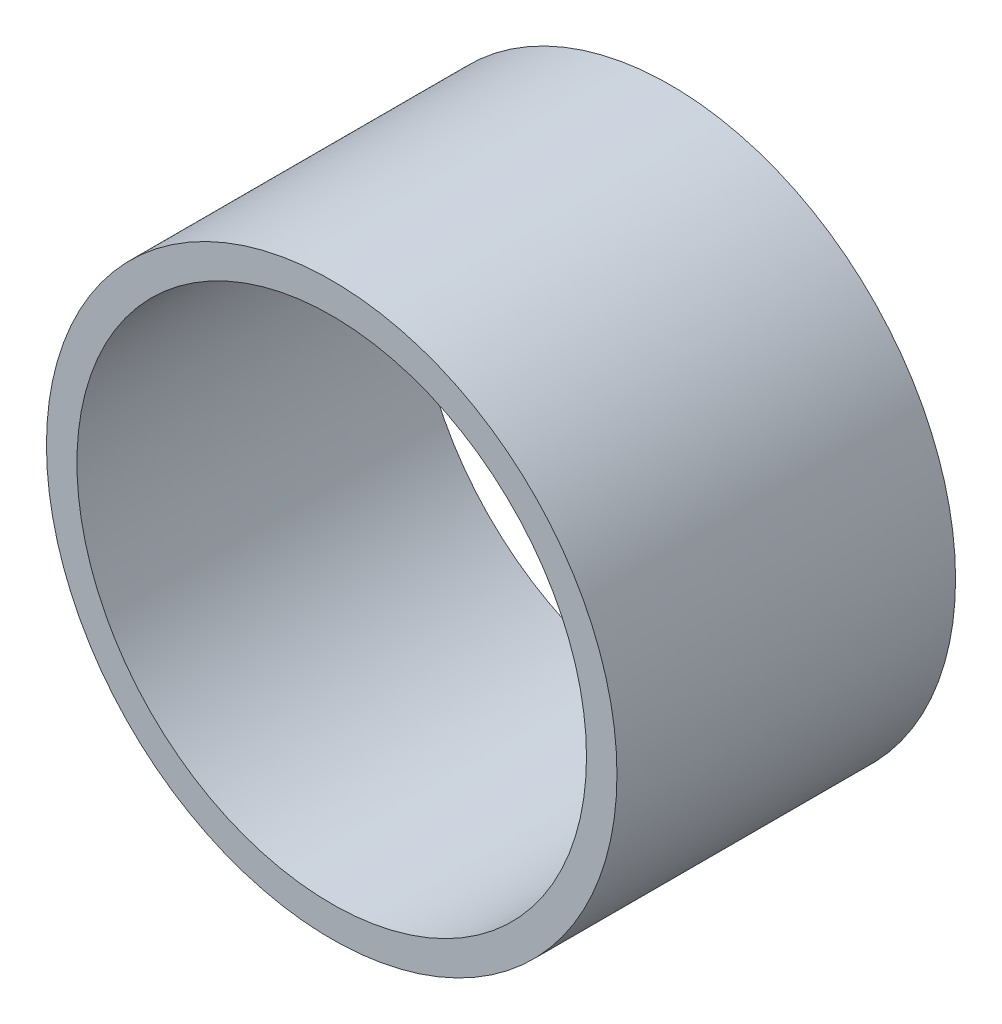
ISO-10303-21;
HEADER;
FILE_DESCRIPTION(('STEP AP214'),'2;1');
FILE_NAME('part.step','',(''),(''),'','','');
FILE_SCHEMA(('AUTOMOTIVE_DESIGN { 1 0 10303 214 1 1 1 1 }'));
ENDSEC;
DATA;
#1=APPLICATION_CONTEXT('core data for automotive mechanical design processes');
#2=APPLICATION_PROTOCOL_DEFINITION('international standard','automotive_design',2000,#1);
#3=PRODUCT_CONTEXT('',#1,'mechanical');
#4=PRODUCT('Part','Part','',(#3));
#5=PRODUCT_RELATED_PRODUCT_CATEGORY('part','',(#4));
#6=PRODUCT_DEFINITION_FORMATION('','',#4);
#7=PRODUCT_DEFINITION_CONTEXT('part definition',#1,'design');
#8=PRODUCT_DEFINITION('design','',#6,#7);
#9=PRODUCT_DEFINITION_SHAPE('','',#8);
#10=(LENGTH_UNIT() NAMED_UNIT(*) SI_UNIT(.MILLI.,.METRE.));
#11=(NAMED_UNIT(*) PLANE_ANGLE_UNIT() SI_UNIT($,.RADIAN.));
#12=(NAMED_UNIT(*) SI_UNIT($,.STERADIAN.) SOLID_ANGLE_UNIT());
#13=UNCERTAINTY_MEASURE_WITH_UNIT(LENGTH_MEASURE(1.E-05),#10,'distance_accuracy_value','');
#14=(GEOMETRIC_REPRESENTATION_CONTEXT(3) GLOBAL_UNCERTAINTY_ASSIGNED_CONTEXT((#13)) GLOBAL_UNIT_ASSIGNED_CONTEXT((#10,
#11,#12)) REPRESENTATION_CONTEXT('',''));
#15=CARTESIAN_POINT('',(0.,0.,0.));
#16=DIRECTION('',(0.,0.,1.));
#17=DIRECTION('',(1.,0.,0.));
#18=AXIS2_PLACEMENT_3D('',#15,#16,#17);
#19=CARTESIAN_POINT('',(0.,0.,20.));
#20=DIRECTION('',(0.,0.,1.));
#21=DIRECTION('',(1.,0.,0.));
#22=AXIS2_PLACEMENT_3D('',#19,#20,#21);
#23=PLANE('',#22);
#24=CARTESIAN_POINT('',(0.,0.,20.));
#25=DIRECTION('',(0.,0.,1.));
#26=DIRECTION('',(1.,0.,0.));
#27=AXIS2_PLACEMENT_3D('',#24,#25,#26);
#28=CIRCLE('',#27,16.85);
#29=CARTESIAN_POINT('',(16.85,0.,20.));
#30=VERTEX_POINT('',#29);
#31=EDGE_CURVE('E11',#30,#30,#28,.T.);
#32=ORIENTED_EDGE('',*,*,#31,.T.);
#33=EDGE_LOOP('',(#32));
#34=FACE_BOUND('',#33,.T.);
#35=CARTESIAN_POINT('',(0.,0.,20.));
#36=DIRECTION('',(0.,0.,1.));
#37=DIRECTION('',(1.,0.,0.));
#38=AXIS2_PLACEMENT_3D('',#35,#36,#37);
#39=CIRCLE('',#38,15.05);
#40=CARTESIAN_POINT('',(15.05,0.,20.));
#41=VERTEX_POINT('',#40);
#42=EDGE_CURVE('E51',#41,#41,#39,.T.);
#43=ORIENTED_EDGE('',*,*,#42,.F.);
#44=EDGE_LOOP('',(#43));
#45=FACE_BOUND('',#44,.T.);
#46=ADVANCED_FACE('F38',(#34,#45),#23,.T.);
#47=CARTESIAN_POINT('',(0.,0.,0.));
#48=DIRECTION('',(0.,0.,1.));
#49=DIRECTION('',(1.,0.,0.));
#50=AXIS2_PLACEMENT_3D('',#47,#48,#49);
#51=PLANE('',#50);
#52=CARTESIAN_POINT('',(0.,0.,0.));
#53=DIRECTION('',(0.,0.,1.));
#54=DIRECTION('',(1.,0.,0.));
#55=AXIS2_PLACEMENT_3D('',#52,#53,#54);
#56=CIRCLE('',#55,16.85);
#57=CARTESIAN_POINT('',(16.85,0.,0.));
#58=VERTEX_POINT('',#57);
#59=EDGE_CURVE('E46',#58,#58,#56,.T.);
#60=ORIENTED_EDGE('',*,*,#59,.F.);
#61=EDGE_LOOP('',(#60));
#62=FACE_BOUND('',#61,.T.);
#63=CARTESIAN_POINT('',(0.,0.,0.));
#64=DIRECTION('',(0.,0.,1.));
#65=DIRECTION('',(1.,0.,0.));
#66=AXIS2_PLACEMENT_3D('',#63,#64,#65);
#67=CIRCLE('',#66,15.05);
#68=CARTESIAN_POINT('',(15.05,0.,0.));
#69=VERTEX_POINT('',#68);
#70=EDGE_CURVE('E42',#69,#69,#67,.T.);
#71=ORIENTED_EDGE('',*,*,#70,.T.);
#72=EDGE_LOOP('',(#71));
#73=FACE_BOUND('',#72,.T.);
#74=ADVANCED_FACE('F59',(#62,#73),#51,.F.);
#75=CARTESIAN_POINT('',(0.,0.,20.));
#76=DIRECTION('',(0.,0.,-1.));
#77=DIRECTION('',(-1.,0.,0.));
#78=AXIS2_PLACEMENT_3D('',#75,#76,#77);
#79=CYLINDRICAL_SURFACE('',#78,16.85);
#80=ORIENTED_EDGE('',*,*,#31,.F.);
#81=EDGE_LOOP('',(#80));
#82=FACE_BOUND('',#81,.T.);
#83=ORIENTED_EDGE('',*,*,#59,.T.);
#84=EDGE_LOOP('',(#83));
#85=FACE_BOUND('',#84,.T.);
#86=ADVANCED_FACE('F62',(#82,#85),#79,.T.);
#87=CARTESIAN_POINT('',(0.,0.,20.));
#88=DIRECTION('',(0.,0.,-1.));
#89=DIRECTION('',(-1.,0.,0.));
#90=AXIS2_PLACEMENT_3D('',#87,#88,#89);
#91=CYLINDRICAL_SURFACE('',#90,15.05);
#92=ORIENTED_EDGE('',*,*,#42,.T.);
#93=EDGE_LOOP('',(#92));
#94=FACE_BOUND('',#93,.T.);
#95=ORIENTED_EDGE('',*,*,#70,.F.);
#96=EDGE_LOOP('',(#95));
#97=FACE_BOUND('',#96,.T.);
#98=ADVANCED_FACE('F40',(#94,#97),#91,.F.);
#99=CLOSED_SHELL('',(#46,#74,#86,#98));
#100=MANIFOLD_SOLID_BREP('B2',#99);
#101=ADVANCED_BREP_SHAPE_REPRESENTATION('',(#18,#100),#14);
#102=SHAPE_DEFINITION_REPRESENTATION(#9,#101);
ENDSEC;
END-ISO-10303-21;
